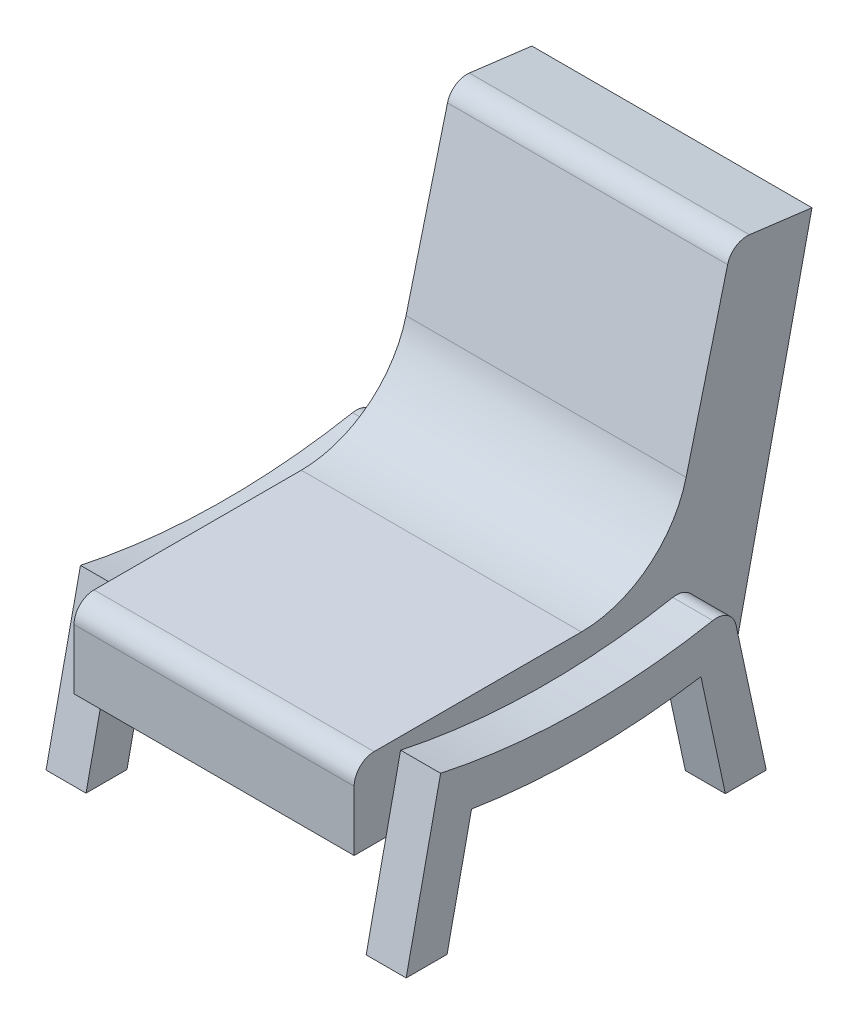
ISO-10303-21;
HEADER;
FILE_DESCRIPTION(('STEP AP214'),'2;1');
FILE_NAME('part.step','',(''),(''),'','','');
FILE_SCHEMA(('AUTOMOTIVE_DESIGN { 1 0 10303 214 1 1 1 1 }'));
ENDSEC;
DATA;
#1=APPLICATION_CONTEXT('core data for automotive mechanical design processes');
#2=APPLICATION_PROTOCOL_DEFINITION('international standard','automotive_design',2000,#1);
#3=PRODUCT_CONTEXT('',#1,'mechanical');
#4=PRODUCT('Part','Part','',(#3));
#5=PRODUCT_RELATED_PRODUCT_CATEGORY('part','',(#4));
#6=PRODUCT_DEFINITION_FORMATION('','',#4);
#7=PRODUCT_DEFINITION_CONTEXT('part definition',#1,'design');
#8=PRODUCT_DEFINITION('design','',#6,#7);
#9=PRODUCT_DEFINITION_SHAPE('','',#8);
#10=(LENGTH_UNIT() NAMED_UNIT(*) SI_UNIT(.MILLI.,.METRE.));
#11=(NAMED_UNIT(*) PLANE_ANGLE_UNIT() SI_UNIT($,.RADIAN.));
#12=(NAMED_UNIT(*) SI_UNIT($,.STERADIAN.) SOLID_ANGLE_UNIT());
#13=UNCERTAINTY_MEASURE_WITH_UNIT(LENGTH_MEASURE(1.E-05),#10,'distance_accuracy_value','');
#14=(GEOMETRIC_REPRESENTATION_CONTEXT(3) GLOBAL_UNCERTAINTY_ASSIGNED_CONTEXT((#13)) GLOBAL_UNIT_ASSIGNED_CONTEXT((#10,
#11,#12)) REPRESENTATION_CONTEXT('',''));
#15=CARTESIAN_POINT('',(0.,0.,0.));
#16=DIRECTION('',(0.,0.,1.));
#17=DIRECTION('',(1.,0.,0.));
#18=AXIS2_PLACEMENT_3D('',#15,#16,#17);
#19=CARTESIAN_POINT('',(80.,38.,43.));
#20=DIRECTION('',(-1.,0.,0.));
#21=DIRECTION('',(0.,0.,1.));
#22=AXIS2_PLACEMENT_3D('',#19,#20,#21);
#23=PLANE('',#22);
#24=DIRECTION('',(0.,-0.977623264558822,-0.21036338225402));
#25=VECTOR('',#24,1.);
#26=CARTESIAN_POINT('',(80.,28.3874434131451,-28.6627470018919));
#27=LINE('',#26,#25);
#28=CARTESIAN_POINT('',(80.,28.3874434131451,-28.6627470018919));
#29=VERTEX_POINT('',#28);
#30=CARTESIAN_POINT('',(80.,23.,-29.8220083034351));
#31=VERTEX_POINT('',#30);
#32=EDGE_CURVE('E271',#29,#31,#27,.T.);
#33=ORIENTED_EDGE('',*,*,#32,.F.);
#34=CARTESIAN_POINT('',(80.,209.128824768676,0.));
#35=DIRECTION('',(1.,0.,0.));
#36=DIRECTION('',(0.,0.,-1.));
#37=AXIS2_PLACEMENT_3D('',#34,#35,#36);
#38=CIRCLE('',#37,183.);
#39=CARTESIAN_POINT('',(80.,28.3874434131451,28.662747001892));
#40=VERTEX_POINT('',#39);
#41=EDGE_CURVE('E245',#40,#29,#38,.T.);
#42=ORIENTED_EDGE('',*,*,#41,.F.);
#43=DIRECTION('',(0.,0.977623264558822,-0.21036338225402));
#44=VECTOR('',#43,1.);
#45=CARTESIAN_POINT('',(80.,0.,34.7711108537165));
#46=LINE('',#45,#44);
#47=CARTESIAN_POINT('',(80.,23.,29.8220083034351));
#48=VERTEX_POINT('',#47);
#49=EDGE_CURVE('E247',#48,#40,#46,.T.);
#50=ORIENTED_EDGE('',*,*,#49,.F.);
#51=DIRECTION('',(0.,0.,-1.));
#52=VECTOR('',#51,1.);
#53=CARTESIAN_POINT('',(80.,23.,48.));
#54=LINE('',#53,#52);
#55=EDGE_CURVE('E502',#48,#31,#54,.T.);
#56=ORIENTED_EDGE('',*,*,#55,.T.);
#57=EDGE_LOOP('',(#33,#42,#50,#56));
#58=FACE_BOUND('',#57,.T.);
#59=ADVANCED_FACE('F33',(#58),#23,.F.);
#60=CARTESIAN_POINT('',(10.,209.128824768676,0.));
#61=DIRECTION('',(1.,0.,0.));
#62=DIRECTION('',(0.,0.,-1.));
#63=AXIS2_PLACEMENT_3D('',#60,#61,#62);
#64=PLANE('',#63);
#65=DIRECTION('',(0.,0.,-1.));
#66=VECTOR('',#65,1.);
#67=CARTESIAN_POINT('',(9.99999999999999,23.,48.));
#68=LINE('',#67,#66);
#69=CARTESIAN_POINT('',(10.,23.,40.0508974497186));
#70=VERTEX_POINT('',#69);
#71=CARTESIAN_POINT('',(10.,23.,29.8220083034351));
#72=VERTEX_POINT('',#71);
#73=EDGE_CURVE('E477',#70,#72,#68,.T.);
#74=ORIENTED_EDGE('',*,*,#73,.F.);
#75=DIRECTION('',(0.,-0.977623264558822,0.21036338225402));
#76=VECTOR('',#75,1.);
#77=CARTESIAN_POINT('',(10.,0.,45.));
#78=LINE('',#77,#76);
#79=CARTESIAN_POINT('',(10.,0.,45.));
#80=VERTEX_POINT('',#79);
#81=EDGE_CURVE('E419',#70,#80,#78,.T.);
#82=ORIENTED_EDGE('',*,*,#81,.T.);
#83=DIRECTION('',(0.,0.,-1.));
#84=VECTOR('',#83,1.);
#85=CARTESIAN_POINT('',(10.,0.,45.));
#86=LINE('',#85,#84);
#87=CARTESIAN_POINT('',(10.,0.,34.7711108537165));
#88=VERTEX_POINT('',#87);
#89=EDGE_CURVE('E396',#80,#88,#86,.T.);
#90=ORIENTED_EDGE('',*,*,#89,.T.);
#91=DIRECTION('',(0.,0.977623264558822,-0.21036338225402));
#92=VECTOR('',#91,1.);
#93=CARTESIAN_POINT('',(10.,0.,34.7711108537165));
#94=LINE('',#93,#92);
#95=EDGE_CURVE('E401',#88,#72,#94,.T.);
#96=ORIENTED_EDGE('',*,*,#95,.T.);
#97=EDGE_LOOP('',(#74,#82,#90,#96));
#98=FACE_BOUND('',#97,.T.);
#99=ADVANCED_FACE('F552',(#98),#64,.T.);
#100=CARTESIAN_POINT('',(10.,0.,45.));
#101=DIRECTION('',(0.,1.,0.));
#102=DIRECTION('',(0.,0.,1.));
#103=AXIS2_PLACEMENT_3D('',#100,#101,#102);
#104=PLANE('',#103);
#105=DIRECTION('',(0.,0.,-1.));
#106=VECTOR('',#105,1.);
#107=CARTESIAN_POINT('',(0.,0.,45.));
#108=LINE('',#107,#106);
#109=CARTESIAN_POINT('',(0.,0.,45.));
#110=VERTEX_POINT('',#109);
#111=CARTESIAN_POINT('',(0.,0.,34.7711108537165));
#112=VERTEX_POINT('',#111);
#113=EDGE_CURVE('E382',#110,#112,#108,.T.);
#114=ORIENTED_EDGE('',*,*,#113,.T.);
#115=DIRECTION('',(-1.,0.,0.));
#116=VECTOR('',#115,1.);
#117=CARTESIAN_POINT('',(10.,0.,34.7711108537165));
#118=LINE('',#117,#116);
#119=EDGE_CURVE('E457',#88,#112,#118,.T.);
#120=ORIENTED_EDGE('',*,*,#119,.F.);
#121=ORIENTED_EDGE('',*,*,#89,.F.);
#122=DIRECTION('',(-1.,0.,0.));
#123=VECTOR('',#122,1.);
#124=CARTESIAN_POINT('',(10.,0.,45.));
#125=LINE('',#124,#123);
#126=EDGE_CURVE('E423',#80,#110,#125,.T.);
#127=ORIENTED_EDGE('',*,*,#126,.T.);
#128=EDGE_LOOP('',(#114,#120,#121,#127));
#129=FACE_BOUND('',#128,.T.);
#130=ADVANCED_FACE('F559',(#129),#104,.F.);
#131=CARTESIAN_POINT('',(10.,0.,34.7711108537165));
#132=DIRECTION('',(0.,0.21036338225402,0.977623264558822));
#133=DIRECTION('',(0.,-0.977623264558823,0.21036338225402));
#134=AXIS2_PLACEMENT_3D('',#131,#132,#133);
#135=PLANE('',#134);
#136=DIRECTION('',(0.,0.977623264558822,-0.21036338225402));
#137=VECTOR('',#136,1.);
#138=CARTESIAN_POINT('',(0.,0.,34.7711108537165));
#139=LINE('',#138,#137);
#140=CARTESIAN_POINT('',(0.,28.3874434131451,28.662747001892));
#141=VERTEX_POINT('',#140);
#142=EDGE_CURVE('E426',#112,#141,#139,.T.);
#143=ORIENTED_EDGE('',*,*,#142,.T.);
#144=DIRECTION('',(-1.,0.,0.));
#145=VECTOR('',#144,1.);
#146=CARTESIAN_POINT('',(10.,28.3874434131451,28.662747001892));
#147=LINE('',#146,#145);
#148=CARTESIAN_POINT('',(10.,28.3874434131451,28.662747001892));
#149=VERTEX_POINT('',#148);
#150=EDGE_CURVE('E454',#149,#141,#147,.T.);
#151=ORIENTED_EDGE('',*,*,#150,.F.);
#152=EDGE_CURVE('E399',#72,#149,#94,.T.);
#153=ORIENTED_EDGE('',*,*,#152,.F.);
#154=ORIENTED_EDGE('',*,*,#95,.F.);
#155=ORIENTED_EDGE('',*,*,#119,.T.);
#156=EDGE_LOOP('',(#143,#151,#153,#154,#155));
#157=FACE_BOUND('',#156,.T.);
#158=ADVANCED_FACE('F607',(#157),#135,.F.);
#159=CARTESIAN_POINT('',(10.,209.128824768676,0.));
#160=DIRECTION('',(-1.,0.,0.));
#161=DIRECTION('',(0.,0.,1.));
#162=AXIS2_PLACEMENT_3D('',#159,#160,#161);
#163=CYLINDRICAL_SURFACE('',#162,183.);
#164=CARTESIAN_POINT('',(0.,209.128824768676,0.));
#165=DIRECTION('',(1.,0.,0.));
#166=DIRECTION('',(0.,0.,-1.));
#167=AXIS2_PLACEMENT_3D('',#164,#165,#166);
#168=CIRCLE('',#167,183.);
#169=CARTESIAN_POINT('',(0.,28.3874434131451,-28.6627470018919));
#170=VERTEX_POINT('',#169);
#171=EDGE_CURVE('E428',#141,#170,#168,.T.);
#172=ORIENTED_EDGE('',*,*,#171,.T.);
#173=DIRECTION('',(-1.,0.,0.));
#174=VECTOR('',#173,1.);
#175=CARTESIAN_POINT('',(10.,28.3874434131451,-28.6627470018919));
#176=LINE('',#175,#174);
#177=CARTESIAN_POINT('',(10.,28.3874434131451,-28.6627470018919));
#178=VERTEX_POINT('',#177);
#179=EDGE_CURVE('E451',#178,#170,#176,.T.);
#180=ORIENTED_EDGE('',*,*,#179,.F.);
#181=CARTESIAN_POINT('',(10.,209.128824768676,0.));
#182=DIRECTION('',(1.,0.,0.));
#183=DIRECTION('',(0.,0.,-1.));
#184=AXIS2_PLACEMENT_3D('',#181,#182,#183);
#185=CIRCLE('',#184,183.);
#186=EDGE_CURVE('E404',#149,#178,#185,.T.);
#187=ORIENTED_EDGE('',*,*,#186,.F.);
#188=ORIENTED_EDGE('',*,*,#150,.T.);
#189=EDGE_LOOP('',(#172,#180,#187,#188));
#190=FACE_BOUND('',#189,.T.);
#191=ADVANCED_FACE('F603',(#190),#163,.T.);
#192=CARTESIAN_POINT('',(10.,28.3874434131451,-28.6627470018919));
#193=DIRECTION('',(0.,0.21036338225402,-0.977623264558822));
#194=DIRECTION('',(0.,0.977623264558822,0.21036338225402));
#195=AXIS2_PLACEMENT_3D('',#192,#193,#194);
#196=PLANE('',#195);
#197=DIRECTION('',(0.,-0.977623264558822,-0.21036338225402));
#198=VECTOR('',#197,1.);
#199=CARTESIAN_POINT('',(0.,28.3874434131451,-28.6627470018919));
#200=LINE('',#199,#198);
#201=CARTESIAN_POINT('',(0.,0.,-34.7711108537165));
#202=VERTEX_POINT('',#201);
#203=EDGE_CURVE('E430',#170,#202,#200,.T.);
#204=ORIENTED_EDGE('',*,*,#203,.T.);
#205=DIRECTION('',(-1.,0.,0.));
#206=VECTOR('',#205,1.);
#207=CARTESIAN_POINT('',(10.,0.,-34.7711108537165));
#208=LINE('',#207,#206);
#209=CARTESIAN_POINT('',(10.,0.,-34.7711108537165));
#210=VERTEX_POINT('',#209);
#211=EDGE_CURVE('E448',#210,#202,#208,.T.);
#212=ORIENTED_EDGE('',*,*,#211,.F.);
#213=DIRECTION('',(0.,-0.977623264558822,-0.21036338225402));
#214=VECTOR('',#213,1.);
#215=CARTESIAN_POINT('',(10.,28.3874434131451,-28.6627470018919));
#216=LINE('',#215,#214);
#217=CARTESIAN_POINT('',(10.,23.,-29.8220083034351));
#218=VERTEX_POINT('',#217);
#219=EDGE_CURVE('E407',#218,#210,#216,.T.);
#220=ORIENTED_EDGE('',*,*,#219,.F.);
#221=EDGE_CURVE('E408',#178,#218,#216,.T.);
#222=ORIENTED_EDGE('',*,*,#221,.F.);
#223=ORIENTED_EDGE('',*,*,#179,.T.);
#224=EDGE_LOOP('',(#204,#212,#220,#222,#223));
#225=FACE_BOUND('',#224,.T.);
#226=ADVANCED_FACE('F599',(#225),#196,.F.);
#227=CARTESIAN_POINT('',(10.,0.,-45.));
#228=DIRECTION('',(0.,1.,0.));
#229=DIRECTION('',(0.,0.,1.));
#230=AXIS2_PLACEMENT_3D('',#227,#228,#229);
#231=PLANE('',#230);
#232=DIRECTION('',(0.,0.,-1.));
#233=VECTOR('',#232,1.);
#234=CARTESIAN_POINT('',(0.,0.,-45.));
#235=LINE('',#234,#233);
#236=CARTESIAN_POINT('',(0.,0.,-45.));
#237=VERTEX_POINT('',#236);
#238=EDGE_CURVE('E432',#202,#237,#235,.T.);
#239=ORIENTED_EDGE('',*,*,#238,.T.);
#240=DIRECTION('',(-1.,0.,0.));
#241=VECTOR('',#240,1.);
#242=CARTESIAN_POINT('',(10.,0.,-45.));
#243=LINE('',#242,#241);
#244=CARTESIAN_POINT('',(10.,0.,-45.));
#245=VERTEX_POINT('',#244);
#246=EDGE_CURVE('E445',#245,#237,#243,.T.);
#247=ORIENTED_EDGE('',*,*,#246,.F.);
#248=DIRECTION('',(0.,0.,-1.));
#249=VECTOR('',#248,1.);
#250=CARTESIAN_POINT('',(10.,0.,-45.));
#251=LINE('',#250,#249);
#252=EDGE_CURVE('E411',#210,#245,#251,.T.);
#253=ORIENTED_EDGE('',*,*,#252,.F.);
#254=ORIENTED_EDGE('',*,*,#211,.T.);
#255=EDGE_LOOP('',(#239,#247,#253,#254));
#256=FACE_BOUND('',#255,.T.);
#257=ADVANCED_FACE('F595',(#256),#231,.F.);
#258=CARTESIAN_POINT('',(10.,40.,-36.3928651299454));
#259=DIRECTION('',(0.,-0.21036338225402,0.977623264558822));
#260=DIRECTION('',(0.,-0.977623264558822,-0.21036338225402));
#261=AXIS2_PLACEMENT_3D('',#258,#259,#260);
#262=PLANE('',#261);
#263=DIRECTION('',(0.,0.977623264558822,0.21036338225402));
#264=VECTOR('',#263,1.);
#265=CARTESIAN_POINT('',(0.,40.,-36.3928651299454));
#266=LINE('',#265,#264);
#267=CARTESIAN_POINT('',(0.,35.1805505442761,-37.4299064165661));
#268=VERTEX_POINT('',#267);
#269=EDGE_CURVE('E434',#237,#268,#266,.T.);
#270=ORIENTED_EDGE('',*,*,#269,.T.);
#271=DIRECTION('',(-1.,0.,0.));
#272=VECTOR('',#271,1.);
#273=CARTESIAN_POINT('',(10.,35.1805505442761,-37.4299064165661));
#274=LINE('',#273,#272);
#275=CARTESIAN_POINT('',(10.,35.1805505442761,-37.4299064165661));
#276=VERTEX_POINT('',#275);
#277=EDGE_CURVE('E465',#268,#276,#274,.F.);
#278=ORIENTED_EDGE('',*,*,#277,.T.);
#279=DIRECTION('',(0.,0.977623264558822,0.21036338225402));
#280=VECTOR('',#279,1.);
#281=CARTESIAN_POINT('',(10.,40.,-36.3928651299454));
#282=LINE('',#281,#280);
#283=CARTESIAN_POINT('',(9.99999999999999,23.,-40.0508974497186));
#284=VERTEX_POINT('',#283);
#285=EDGE_CURVE('E413',#284,#276,#282,.T.);
#286=ORIENTED_EDGE('',*,*,#285,.F.);
#287=EDGE_CURVE('E414',#245,#284,#282,.T.);
#288=ORIENTED_EDGE('',*,*,#287,.F.);
#289=ORIENTED_EDGE('',*,*,#246,.T.);
#290=EDGE_LOOP('',(#270,#278,#286,#288,#289));
#291=FACE_BOUND('',#290,.T.);
#292=ADVANCED_FACE('F591',(#291),#262,.F.);
#293=CARTESIAN_POINT('',(10.,209.128824768676,0.));
#294=DIRECTION('',(-1.,0.,0.));
#295=DIRECTION('',(0.,0.,1.));
#296=AXIS2_PLACEMENT_3D('',#293,#294,#295);
#297=CYLINDRICAL_SURFACE('',#296,173.);
#298=CARTESIAN_POINT('',(10.,209.128824768676,0.));
#299=DIRECTION('',(-1.,0.,0.));
#300=DIRECTION('',(0.,0.,-1.));
#301=AXIS2_PLACEMENT_3D('',#298,#299,#300);
#302=CIRCLE('',#301,173.);
#303=CARTESIAN_POINT('',(10.,39.0444665300754,-31.6276948664188));
#304=VERTEX_POINT('',#303);
#305=CARTESIAN_POINT('',(10.,40.,36.3928651299455));
#306=VERTEX_POINT('',#305);
#307=EDGE_CURVE('E416',#304,#306,#302,.T.);
#308=ORIENTED_EDGE('',*,*,#307,.F.);
#309=DIRECTION('',(-1.,0.,0.));
#310=VECTOR('',#309,1.);
#311=CARTESIAN_POINT('',(10.,39.0444665300754,-31.6276948664189));
#312=LINE('',#311,#310);
#313=CARTESIAN_POINT('',(0.,39.0444665300754,-31.6276948664188));
#314=VERTEX_POINT('',#313);
#315=EDGE_CURVE('E460',#304,#314,#312,.T.);
#316=ORIENTED_EDGE('',*,*,#315,.T.);
#317=CARTESIAN_POINT('',(0.,209.128824768676,0.));
#318=DIRECTION('',(-1.,0.,0.));
#319=DIRECTION('',(0.,0.,-1.));
#320=AXIS2_PLACEMENT_3D('',#317,#318,#319);
#321=CIRCLE('',#320,173.);
#322=CARTESIAN_POINT('',(0.,40.,36.3928651299455));
#323=VERTEX_POINT('',#322);
#324=EDGE_CURVE('E437',#314,#323,#321,.T.);
#325=ORIENTED_EDGE('',*,*,#324,.T.);
#326=DIRECTION('',(-1.,0.,0.));
#327=VECTOR('',#326,1.);
#328=CARTESIAN_POINT('',(10.,40.,36.3928651299455));
#329=LINE('',#328,#327);
#330=EDGE_CURVE('E442',#306,#323,#329,.T.);
#331=ORIENTED_EDGE('',*,*,#330,.F.);
#332=EDGE_LOOP('',(#308,#316,#325,#331));
#333=FACE_BOUND('',#332,.T.);
#334=ADVANCED_FACE('F587',(#333),#297,.F.);
#335=CARTESIAN_POINT('',(10.,0.,45.));
#336=DIRECTION('',(0.,-0.21036338225402,-0.977623264558822));
#337=DIRECTION('',(0.,0.977623264558822,-0.21036338225402));
#338=AXIS2_PLACEMENT_3D('',#335,#336,#337);
#339=PLANE('',#338);
#340=DIRECTION('',(0.,-0.977623264558822,0.21036338225402));
#341=VECTOR('',#340,1.);
#342=CARTESIAN_POINT('',(0.,0.,45.));
#343=LINE('',#342,#341);
#344=EDGE_CURVE('E400',#323,#110,#343,.T.);
#345=ORIENTED_EDGE('',*,*,#344,.T.);
#346=ORIENTED_EDGE('',*,*,#126,.F.);
#347=ORIENTED_EDGE('',*,*,#81,.F.);
#348=EDGE_CURVE('E420',#306,#70,#78,.T.);
#349=ORIENTED_EDGE('',*,*,#348,.F.);
#350=ORIENTED_EDGE('',*,*,#330,.T.);
#351=EDGE_LOOP('',(#345,#346,#347,#349,#350));
#352=FACE_BOUND('',#351,.T.);
#353=ADVANCED_FACE('F579',(#352),#339,.F.);
#354=EDGE_CURVE('E368',#218,#284,#68,.T.);
#355=ORIENTED_EDGE('',*,*,#354,.F.);
#356=ORIENTED_EDGE('',*,*,#219,.T.);
#357=ORIENTED_EDGE('',*,*,#252,.T.);
#358=ORIENTED_EDGE('',*,*,#287,.T.);
#359=EDGE_LOOP('',(#355,#356,#357,#358));
#360=FACE_BOUND('',#359,.T.);
#361=ADVANCED_FACE('F562',(#360),#64,.T.);
#362=CARTESIAN_POINT('',(0.,209.128824768676,0.));
#363=DIRECTION('',(1.,0.,0.));
#364=DIRECTION('',(0.,0.,-1.));
#365=AXIS2_PLACEMENT_3D('',#362,#363,#364);
#366=PLANE('',#365);
#367=ORIENTED_EDGE('',*,*,#324,.F.);
#368=CARTESIAN_POINT('',(0.,34.128733633006,-32.541790093772));
#369=DIRECTION('',(1.,0.,0.));
#370=DIRECTION('',(0.,0.,-1.));
#371=AXIS2_PLACEMENT_3D('',#368,#369,#370);
#372=CIRCLE('',#371,5.);
#373=EDGE_CURVE('E463',#314,#268,#372,.F.);
#374=ORIENTED_EDGE('',*,*,#373,.T.);
#375=ORIENTED_EDGE('',*,*,#269,.F.);
#376=ORIENTED_EDGE('',*,*,#238,.F.);
#377=ORIENTED_EDGE('',*,*,#203,.F.);
#378=ORIENTED_EDGE('',*,*,#171,.F.);
#379=ORIENTED_EDGE('',*,*,#142,.F.);
#380=ORIENTED_EDGE('',*,*,#113,.F.);
#381=ORIENTED_EDGE('',*,*,#344,.F.);
#382=EDGE_LOOP('',(#367,#374,#375,#376,#377,#378,#379,#380,#381));
#383=FACE_BOUND('',#382,.T.);
#384=ADVANCED_FACE('F578',(#383),#366,.F.);
#385=CARTESIAN_POINT('',(10.,34.128733633006,-32.541790093772));
#386=DIRECTION('',(-1.,0.,0.));
#387=DIRECTION('',(0.,0.,1.));
#388=AXIS2_PLACEMENT_3D('',#385,#386,#387);
#389=CYLINDRICAL_SURFACE('',#388,5.);
#390=CARTESIAN_POINT('',(10.,34.128733633006,-32.541790093772));
#391=DIRECTION('',(1.,0.,0.));
#392=DIRECTION('',(0.,0.,-1.));
#393=AXIS2_PLACEMENT_3D('',#390,#391,#392);
#394=CIRCLE('',#393,5.);
#395=EDGE_CURVE('E467',#276,#304,#394,.T.);
#396=ORIENTED_EDGE('',*,*,#395,.F.);
#397=ORIENTED_EDGE('',*,*,#277,.F.);
#398=ORIENTED_EDGE('',*,*,#373,.F.);
#399=ORIENTED_EDGE('',*,*,#315,.F.);
#400=EDGE_LOOP('',(#396,#397,#398,#399));
#401=FACE_BOUND('',#400,.T.);
#402=ADVANCED_FACE('F583',(#401),#389,.T.);
#403=CARTESIAN_POINT('',(9.99999999999999,38.,43.));
#404=DIRECTION('',(-1.,0.,0.));
#405=DIRECTION('',(0.,0.,1.));
#406=AXIS2_PLACEMENT_3D('',#403,#404,#405);
#407=PLANE('',#406);
#408=DIRECTION('',(0.,0.969310344580997,-0.245840305662576));
#409=VECTOR('',#408,1.);
#410=CARTESIAN_POINT('',(9.99999999999999,106.741704173388,-45.9670958601257));
#411=LINE('',#410,#409);
#412=CARTESIAN_POINT('',(9.99999999999999,63.3623117471105,-34.9650435729991));
#413=VERTEX_POINT('',#412);
#414=CARTESIAN_POINT('',(9.99999999999999,104.232276988287,-45.3306450580971));
#415=VERTEX_POINT('',#414);
#416=EDGE_CURVE('E329',#413,#415,#411,.T.);
#417=ORIENTED_EDGE('',*,*,#416,.T.);
#418=CARTESIAN_POINT('',(9.99999999999999,103.003075459974,-50.1771967810021));
#419=DIRECTION('',(-1.,0.,0.));
#420=DIRECTION('',(0.,0.,1.));
#421=AXIS2_PLACEMENT_3D('',#418,#419,#420);
#422=CIRCLE('',#421,5.);
#423=CARTESIAN_POINT('',(9.99999999999999,107.96399357497,-50.8011290339819));
#424=VERTEX_POINT('',#423);
#425=EDGE_CURVE('E55',#415,#424,#422,.T.);
#426=ORIENTED_EDGE('',*,*,#425,.T.);
#427=DIRECTION('',(0.,-0.124786450595951,-0.992183622999122));
#428=VECTOR('',#427,1.);
#429=CARTESIAN_POINT('',(9.99999999999999,108.515390250421,-46.4169451057929));
#430=LINE('',#429,#428);
#431=CARTESIAN_POINT('',(9.99999999999999,106.,-66.4169451057929));
#432=VERTEX_POINT('',#431);
#433=EDGE_CURVE('E357',#424,#432,#430,.T.);
#434=ORIENTED_EDGE('',*,*,#433,.T.);
#435=DIRECTION('',(0.,-0.976255506895255,0.216622217827927));
#436=VECTOR('',#435,1.);
#437=CARTESIAN_POINT('',(9.99999999999999,106.,-66.4169451057929));
#438=LINE('',#437,#436);
#439=CARTESIAN_POINT('',(9.99999999999999,23.,-48.));
#440=VERTEX_POINT('',#439);
#441=EDGE_CURVE('E359',#432,#440,#438,.T.);
#442=ORIENTED_EDGE('',*,*,#441,.T.);
#443=EDGE_CURVE('E362',#284,#440,#68,.T.);
#444=ORIENTED_EDGE('',*,*,#443,.F.);
#445=ORIENTED_EDGE('',*,*,#285,.T.);
#446=ORIENTED_EDGE('',*,*,#395,.T.);
#447=ORIENTED_EDGE('',*,*,#307,.T.);
#448=ORIENTED_EDGE('',*,*,#348,.T.);
#449=CARTESIAN_POINT('',(9.99999999999999,23.,48.));
#450=VERTEX_POINT('',#449);
#451=EDGE_CURVE('E363',#450,#70,#68,.T.);
#452=ORIENTED_EDGE('',*,*,#451,.F.);
#453=DIRECTION('',(0.,1.,0.));
#454=VECTOR('',#453,1.);
#455=CARTESIAN_POINT('',(9.99999999999999,23.,48.));
#456=LINE('',#455,#454);
#457=CARTESIAN_POINT('',(9.99999999999999,38.,48.));
#458=VERTEX_POINT('',#457);
#459=EDGE_CURVE('E366',#450,#458,#456,.T.);
#460=ORIENTED_EDGE('',*,*,#459,.T.);
#461=CARTESIAN_POINT('',(9.99999999999999,38.,43.));
#462=DIRECTION('',(-1.,0.,0.));
#463=DIRECTION('',(0.,0.,1.));
#464=AXIS2_PLACEMENT_3D('',#461,#462,#463);
#465=CIRCLE('',#464,5.);
#466=CARTESIAN_POINT('',(9.99999999999999,43.,43.));
#467=VERTEX_POINT('',#466);
#468=EDGE_CURVE('E371',#458,#467,#465,.T.);
#469=ORIENTED_EDGE('',*,*,#468,.T.);
#470=DIRECTION('',(0.,0.,-1.));
#471=VECTOR('',#470,1.);
#472=CARTESIAN_POINT('',(9.99999999999999,43.,43.));
#473=LINE('',#472,#471);
#474=CARTESIAN_POINT('',(9.99999999999999,43.,-8.79366426931216));
#475=VERTEX_POINT('',#474);
#476=EDGE_CURVE('E374',#467,#475,#473,.T.);
#477=ORIENTED_EDGE('',*,*,#476,.T.);
#478=CARTESIAN_POINT('',(9.99999999999999,70.,-8.79366426931216));
#479=DIRECTION('',(1.,0.,0.));
#480=DIRECTION('',(0.,0.,-1.));
#481=AXIS2_PLACEMENT_3D('',#478,#479,#480);
#482=CIRCLE('',#481,27.);
#483=EDGE_CURVE('E334',#475,#413,#482,.T.);
#484=ORIENTED_EDGE('',*,*,#483,.T.);
#485=EDGE_LOOP('',(#417,#426,#434,#442,#444,#445,#446,#447,#448,#452,#460,#469,#477,#484));
#486=FACE_BOUND('',#485,.T.);
#487=ADVANCED_FACE('F495',(#486),#407,.T.);
#488=CARTESIAN_POINT('',(80.,70.,-8.79366426931216));
#489=DIRECTION('',(-1.,0.,0.));
#490=DIRECTION('',(0.,0.,1.));
#491=AXIS2_PLACEMENT_3D('',#488,#489,#490);
#492=CYLINDRICAL_SURFACE('',#491,27.);
#493=ORIENTED_EDGE('',*,*,#483,.F.);
#494=DIRECTION('',(-1.,0.,0.));
#495=VECTOR('',#494,1.);
#496=CARTESIAN_POINT('',(80.,43.,-8.79366426931216));
#497=LINE('',#496,#495);
#498=CARTESIAN_POINT('',(80.,43.,-8.79366426931216));
#499=VERTEX_POINT('',#498);
#500=EDGE_CURVE('E383',#499,#475,#497,.T.);
#501=ORIENTED_EDGE('',*,*,#500,.F.);
#502=CARTESIAN_POINT('',(80.,70.,-8.79366426931216));
#503=DIRECTION('',(1.,0.,0.));
#504=DIRECTION('',(0.,0.,-1.));
#505=AXIS2_PLACEMENT_3D('',#502,#503,#504);
#506=CIRCLE('',#505,27.);
#507=CARTESIAN_POINT('',(80.,63.3623117471105,-34.9650435729991));
#508=VERTEX_POINT('',#507);
#509=EDGE_CURVE('E352',#499,#508,#506,.T.);
#510=ORIENTED_EDGE('',*,*,#509,.T.);
#511=DIRECTION('',(-1.,0.,0.));
#512=VECTOR('',#511,1.);
#513=CARTESIAN_POINT('',(80.,63.3623117471105,-34.9650435729991));
#514=LINE('',#513,#512);
#515=EDGE_CURVE('E379',#508,#413,#514,.T.);
#516=ORIENTED_EDGE('',*,*,#515,.T.);
#517=EDGE_LOOP('',(#493,#501,#510,#516));
#518=FACE_BOUND('',#517,.T.);
#519=ADVANCED_FACE('F537',(#518),#492,.F.);
#520=CARTESIAN_POINT('',(80.,43.,43.));
#521=DIRECTION('',(0.,1.,0.));
#522=DIRECTION('',(0.,0.,1.));
#523=AXIS2_PLACEMENT_3D('',#520,#521,#522);
#524=PLANE('',#523);
#525=ORIENTED_EDGE('',*,*,#476,.F.);
#526=DIRECTION('',(-1.,0.,0.));
#527=VECTOR('',#526,1.);
#528=CARTESIAN_POINT('',(80.,43.,43.));
#529=LINE('',#528,#527);
#530=CARTESIAN_POINT('',(80.,43.,43.));
#531=VERTEX_POINT('',#530);
#532=EDGE_CURVE('E385',#531,#467,#529,.T.);
#533=ORIENTED_EDGE('',*,*,#532,.F.);
#534=DIRECTION('',(0.,0.,-1.));
#535=VECTOR('',#534,1.);
#536=CARTESIAN_POINT('',(80.,43.,43.));
#537=LINE('',#536,#535);
#538=EDGE_CURVE('E349',#531,#499,#537,.T.);
#539=ORIENTED_EDGE('',*,*,#538,.T.);
#540=ORIENTED_EDGE('',*,*,#500,.T.);
#541=EDGE_LOOP('',(#525,#533,#539,#540));
#542=FACE_BOUND('',#541,.T.);
#543=ADVANCED_FACE('F645',(#542),#524,.T.);
#544=CARTESIAN_POINT('',(80.,38.,43.));
#545=DIRECTION('',(-1.,0.,0.));
#546=DIRECTION('',(0.,0.,1.));
#547=AXIS2_PLACEMENT_3D('',#544,#545,#546);
#548=CYLINDRICAL_SURFACE('',#547,5.);
#549=ORIENTED_EDGE('',*,*,#468,.F.);
#550=DIRECTION('',(-1.,0.,0.));
#551=VECTOR('',#550,1.);
#552=CARTESIAN_POINT('',(80.,38.,48.));
#553=LINE('',#552,#551);
#554=CARTESIAN_POINT('',(80.,38.,48.));
#555=VERTEX_POINT('',#554);
#556=EDGE_CURVE('E387',#555,#458,#553,.T.);
#557=ORIENTED_EDGE('',*,*,#556,.F.);
#558=CARTESIAN_POINT('',(80.,38.,43.));
#559=DIRECTION('',(-1.,0.,0.));
#560=DIRECTION('',(0.,0.,1.));
#561=AXIS2_PLACEMENT_3D('',#558,#559,#560);
#562=CIRCLE('',#561,5.);
#563=EDGE_CURVE('E346',#555,#531,#562,.T.);
#564=ORIENTED_EDGE('',*,*,#563,.T.);
#565=ORIENTED_EDGE('',*,*,#532,.T.);
#566=EDGE_LOOP('',(#549,#557,#564,#565));
#567=FACE_BOUND('',#566,.T.);
#568=ADVANCED_FACE('F532',(#567),#548,.T.);
#569=CARTESIAN_POINT('',(80.,23.,48.));
#570=DIRECTION('',(0.,0.,1.));
#571=DIRECTION('',(1.,0.,0.));
#572=AXIS2_PLACEMENT_3D('',#569,#570,#571);
#573=PLANE('',#572);
#574=ORIENTED_EDGE('',*,*,#459,.F.);
#575=DIRECTION('',(-1.,0.,0.));
#576=VECTOR('',#575,1.);
#577=CARTESIAN_POINT('',(80.,23.,48.));
#578=LINE('',#577,#576);
#579=CARTESIAN_POINT('',(80.,23.,48.));
#580=VERTEX_POINT('',#579);
#581=EDGE_CURVE('E389',#580,#450,#578,.T.);
#582=ORIENTED_EDGE('',*,*,#581,.F.);
#583=DIRECTION('',(0.,1.,0.));
#584=VECTOR('',#583,1.);
#585=CARTESIAN_POINT('',(80.,23.,48.));
#586=LINE('',#585,#584);
#587=EDGE_CURVE('E343',#580,#555,#586,.T.);
#588=ORIENTED_EDGE('',*,*,#587,.T.);
#589=ORIENTED_EDGE('',*,*,#556,.T.);
#590=EDGE_LOOP('',(#574,#582,#588,#589));
#591=FACE_BOUND('',#590,.T.);
#592=ADVANCED_FACE('F529',(#591),#573,.T.);
#593=CARTESIAN_POINT('',(80.,23.,48.));
#594=DIRECTION('',(0.,1.,0.));
#595=DIRECTION('',(0.,0.,1.));
#596=AXIS2_PLACEMENT_3D('',#593,#594,#595);
#597=PLANE('',#596);
#598=ORIENTED_EDGE('',*,*,#451,.T.);
#599=ORIENTED_EDGE('',*,*,#73,.T.);
#600=EDGE_CURVE('E367',#72,#218,#68,.T.);
#601=ORIENTED_EDGE('',*,*,#600,.T.);
#602=ORIENTED_EDGE('',*,*,#354,.T.);
#603=ORIENTED_EDGE('',*,*,#443,.T.);
#604=DIRECTION('',(-1.,0.,0.));
#605=VECTOR('',#604,1.);
#606=CARTESIAN_POINT('',(80.,23.,-48.));
#607=LINE('',#606,#605);
#608=CARTESIAN_POINT('',(80.,23.,-48.));
#609=VERTEX_POINT('',#608);
#610=EDGE_CURVE('E391',#609,#440,#607,.T.);
#611=ORIENTED_EDGE('',*,*,#610,.F.);
#612=CARTESIAN_POINT('',(80.,23.,-40.0508974497186));
#613=VERTEX_POINT('',#612);
#614=EDGE_CURVE('E339',#613,#609,#54,.T.);
#615=ORIENTED_EDGE('',*,*,#614,.F.);
#616=EDGE_CURVE('E501',#31,#613,#54,.T.);
#617=ORIENTED_EDGE('',*,*,#616,.F.);
#618=ORIENTED_EDGE('',*,*,#55,.F.);
#619=CARTESIAN_POINT('',(80.,23.,40.0508974497186));
#620=VERTEX_POINT('',#619);
#621=EDGE_CURVE('E242',#620,#48,#54,.T.);
#622=ORIENTED_EDGE('',*,*,#621,.F.);
#623=EDGE_CURVE('E340',#580,#620,#54,.T.);
#624=ORIENTED_EDGE('',*,*,#623,.F.);
#625=ORIENTED_EDGE('',*,*,#581,.T.);
#626=EDGE_LOOP('',(#598,#599,#601,#602,#603,#611,#615,#617,#618,#622,#624,#625));
#627=FACE_BOUND('',#626,.T.);
#628=ADVANCED_FACE('F487',(#627),#597,.F.);
#629=CARTESIAN_POINT('',(80.,106.,-66.4169451057929));
#630=DIRECTION('',(0.,-0.216622217827927,-0.976255506895255));
#631=DIRECTION('',(0.,0.976255506895255,-0.216622217827927));
#632=AXIS2_PLACEMENT_3D('',#629,#630,#631);
#633=PLANE('',#632);
#634=ORIENTED_EDGE('',*,*,#441,.F.);
#635=DIRECTION('',(-1.,0.,0.));
#636=VECTOR('',#635,1.);
#637=CARTESIAN_POINT('',(80.,106.,-66.4169451057929));
#638=LINE('',#637,#636);
#639=CARTESIAN_POINT('',(80.,106.,-66.4169451057929));
#640=VERTEX_POINT('',#639);
#641=EDGE_CURVE('E355',#640,#432,#638,.T.);
#642=ORIENTED_EDGE('',*,*,#641,.F.);
#643=DIRECTION('',(0.,-0.976255506895255,0.216622217827927));
#644=VECTOR('',#643,1.);
#645=CARTESIAN_POINT('',(80.,106.,-66.4169451057929));
#646=LINE('',#645,#644);
#647=EDGE_CURVE('E336',#640,#609,#646,.T.);
#648=ORIENTED_EDGE('',*,*,#647,.T.);
#649=ORIENTED_EDGE('',*,*,#610,.T.);
#650=EDGE_LOOP('',(#634,#642,#648,#649));
#651=FACE_BOUND('',#650,.T.);
#652=ADVANCED_FACE('F492',(#651),#633,.T.);
#653=CARTESIAN_POINT('',(80.,108.515390250421,-46.4169451057929));
#654=DIRECTION('',(0.,0.992183622999122,-0.124786450595951));
#655=DIRECTION('',(0.,0.124786450595951,0.992183622999122));
#656=AXIS2_PLACEMENT_3D('',#653,#654,#655);
#657=PLANE('',#656);
#658=ORIENTED_EDGE('',*,*,#433,.F.);
#659=DIRECTION('',(-1.,0.,0.));
#660=VECTOR('',#659,1.);
#661=CARTESIAN_POINT('',(80.,107.96399357497,-50.8011290339819));
#662=LINE('',#661,#660);
#663=CARTESIAN_POINT('',(80.,107.96399357497,-50.8011290339819));
#664=VERTEX_POINT('',#663);
#665=EDGE_CURVE('E41',#424,#664,#662,.F.);
#666=ORIENTED_EDGE('',*,*,#665,.T.);
#667=DIRECTION('',(0.,-0.124786450595951,-0.992183622999122));
#668=VECTOR('',#667,1.);
#669=CARTESIAN_POINT('',(80.,108.515390250421,-46.4169451057929));
#670=LINE('',#669,#668);
#671=EDGE_CURVE('E333',#664,#640,#670,.T.);
#672=ORIENTED_EDGE('',*,*,#671,.T.);
#673=ORIENTED_EDGE('',*,*,#641,.T.);
#674=EDGE_LOOP('',(#658,#666,#672,#673));
#675=FACE_BOUND('',#674,.T.);
#676=ADVANCED_FACE('F496',(#675),#657,.T.);
#677=CARTESIAN_POINT('',(80.,106.741704173388,-45.9670958601257));
#678=DIRECTION('',(0.,0.245840305662576,0.969310344580997));
#679=DIRECTION('',(0.,-0.969310344580997,0.245840305662576));
#680=AXIS2_PLACEMENT_3D('',#677,#678,#679);
#681=PLANE('',#680);
#682=DIRECTION('',(0.,0.969310344580997,-0.245840305662575));
#683=VECTOR('',#682,1.);
#684=CARTESIAN_POINT('',(80.,63.3623117471105,-34.9650435729991));
#685=LINE('',#684,#683);
#686=CARTESIAN_POINT('',(80.,104.232276988287,-45.3306450580971));
#687=VERTEX_POINT('',#686);
#688=EDGE_CURVE('E330',#508,#687,#685,.T.);
#689=ORIENTED_EDGE('',*,*,#688,.T.);
#690=DIRECTION('',(-1.,0.,0.));
#691=VECTOR('',#690,1.);
#692=CARTESIAN_POINT('',(80.,104.232276988287,-45.3306450580971));
#693=LINE('',#692,#691);
#694=EDGE_CURVE('E470',#687,#415,#693,.T.);
#695=ORIENTED_EDGE('',*,*,#694,.T.);
#696=ORIENTED_EDGE('',*,*,#416,.F.);
#697=ORIENTED_EDGE('',*,*,#515,.F.);
#698=EDGE_LOOP('',(#689,#695,#696,#697));
#699=FACE_BOUND('',#698,.T.);
#700=ADVANCED_FACE('F540',(#699),#681,.T.);
#701=ORIENTED_EDGE('',*,*,#671,.F.);
#702=CARTESIAN_POINT('',(80.,103.003075459974,-50.1771967810021));
#703=DIRECTION('',(-1.,0.,0.));
#704=DIRECTION('',(0.,0.,1.));
#705=AXIS2_PLACEMENT_3D('',#702,#703,#704);
#706=CIRCLE('',#705,5.);
#707=EDGE_CURVE('E11',#664,#687,#706,.F.);
#708=ORIENTED_EDGE('',*,*,#707,.T.);
#709=ORIENTED_EDGE('',*,*,#688,.F.);
#710=ORIENTED_EDGE('',*,*,#509,.F.);
#711=ORIENTED_EDGE('',*,*,#538,.F.);
#712=ORIENTED_EDGE('',*,*,#563,.F.);
#713=ORIENTED_EDGE('',*,*,#587,.F.);
#714=ORIENTED_EDGE('',*,*,#623,.T.);
#715=DIRECTION('',(0.,-0.977623264558822,0.21036338225402));
#716=VECTOR('',#715,1.);
#717=CARTESIAN_POINT('',(80.,0.,45.));
#718=LINE('',#717,#716);
#719=CARTESIAN_POINT('',(80.,40.,36.3928651299455));
#720=VERTEX_POINT('',#719);
#721=EDGE_CURVE('E285',#720,#620,#718,.T.);
#722=ORIENTED_EDGE('',*,*,#721,.F.);
#723=CARTESIAN_POINT('',(80.,209.128824768676,0.));
#724=DIRECTION('',(-1.,0.,0.));
#725=DIRECTION('',(0.,0.,-1.));
#726=AXIS2_PLACEMENT_3D('',#723,#724,#725);
#727=CIRCLE('',#726,173.);
#728=CARTESIAN_POINT('',(80.,39.0444665300754,-31.6276948664188));
#729=VERTEX_POINT('',#728);
#730=EDGE_CURVE('E280',#729,#720,#727,.T.);
#731=ORIENTED_EDGE('',*,*,#730,.F.);
#732=CARTESIAN_POINT('',(80.,34.128733633006,-32.541790093772));
#733=DIRECTION('',(1.,0.,0.));
#734=DIRECTION('',(0.,0.,-1.));
#735=AXIS2_PLACEMENT_3D('',#732,#733,#734);
#736=CIRCLE('',#735,5.);
#737=CARTESIAN_POINT('',(80.,35.1805505442761,-37.4299064165661));
#738=VERTEX_POINT('',#737);
#739=EDGE_CURVE('E326',#738,#729,#736,.T.);
#740=ORIENTED_EDGE('',*,*,#739,.F.);
#741=DIRECTION('',(0.,0.977623264558822,0.21036338225402));
#742=VECTOR('',#741,1.);
#743=CARTESIAN_POINT('',(80.,40.,-36.3928651299454));
#744=LINE('',#743,#742);
#745=EDGE_CURVE('E281',#613,#738,#744,.T.);
#746=ORIENTED_EDGE('',*,*,#745,.F.);
#747=ORIENTED_EDGE('',*,*,#614,.T.);
#748=ORIENTED_EDGE('',*,*,#647,.F.);
#749=EDGE_LOOP('',(#701,#708,#709,#710,#711,#712,#713,#714,#722,#731,#740,#746,#747,#748));
#750=FACE_BOUND('',#749,.T.);
#751=ADVANCED_FACE('F498',(#750),#23,.F.);
#752=ORIENTED_EDGE('',*,*,#600,.F.);
#753=ORIENTED_EDGE('',*,*,#152,.T.);
#754=ORIENTED_EDGE('',*,*,#186,.T.);
#755=ORIENTED_EDGE('',*,*,#221,.T.);
#756=EDGE_LOOP('',(#752,#753,#754,#755));
#757=FACE_BOUND('',#756,.T.);
#758=ADVANCED_FACE('F565',(#757),#407,.T.);
#759=CARTESIAN_POINT('',(80.,209.128824768676,0.));
#760=DIRECTION('',(-1.,0.,0.));
#761=DIRECTION('',(0.,0.,-1.));
#762=AXIS2_PLACEMENT_3D('',#759,#760,#761);
#763=PLANE('',#762);
#764=CARTESIAN_POINT('',(80.,0.,45.));
#765=VERTEX_POINT('',#764);
#766=EDGE_CURVE('E284',#620,#765,#718,.T.);
#767=ORIENTED_EDGE('',*,*,#766,.F.);
#768=ORIENTED_EDGE('',*,*,#621,.T.);
#769=CARTESIAN_POINT('',(80.,0.,34.7711108537165));
#770=VERTEX_POINT('',#769);
#771=EDGE_CURVE('E235',#770,#48,#46,.T.);
#772=ORIENTED_EDGE('',*,*,#771,.F.);
#773=DIRECTION('',(0.,0.,-1.));
#774=VECTOR('',#773,1.);
#775=CARTESIAN_POINT('',(80.,0.,45.));
#776=LINE('',#775,#774);
#777=EDGE_CURVE('E240',#765,#770,#776,.T.);
#778=ORIENTED_EDGE('',*,*,#777,.F.);
#779=EDGE_LOOP('',(#767,#768,#772,#778));
#780=FACE_BOUND('',#779,.T.);
#781=ADVANCED_FACE('F238',(#780),#763,.T.);
#782=CARTESIAN_POINT('',(80.,0.,45.));
#783=DIRECTION('',(0.,1.,0.));
#784=DIRECTION('',(0.,0.,1.));
#785=AXIS2_PLACEMENT_3D('',#782,#783,#784);
#786=PLANE('',#785);
#787=DIRECTION('',(0.,0.,-1.));
#788=VECTOR('',#787,1.);
#789=CARTESIAN_POINT('',(90.,0.,45.));
#790=LINE('',#789,#788);
#791=CARTESIAN_POINT('',(90.,0.,45.));
#792=VERTEX_POINT('',#791);
#793=CARTESIAN_POINT('',(90.,0.,34.7711108537165));
#794=VERTEX_POINT('',#793);
#795=EDGE_CURVE('E288',#792,#794,#790,.T.);
#796=ORIENTED_EDGE('',*,*,#795,.F.);
#797=DIRECTION('',(1.,0.,0.));
#798=VECTOR('',#797,1.);
#799=CARTESIAN_POINT('',(80.,0.,45.));
#800=LINE('',#799,#798);
#801=EDGE_CURVE('E262',#765,#792,#800,.T.);
#802=ORIENTED_EDGE('',*,*,#801,.F.);
#803=ORIENTED_EDGE('',*,*,#777,.T.);
#804=DIRECTION('',(1.,0.,0.));
#805=VECTOR('',#804,1.);
#806=CARTESIAN_POINT('',(80.,0.,34.7711108537165));
#807=LINE('',#806,#805);
#808=EDGE_CURVE('E249',#770,#794,#807,.T.);
#809=ORIENTED_EDGE('',*,*,#808,.T.);
#810=EDGE_LOOP('',(#796,#802,#803,#809));
#811=FACE_BOUND('',#810,.T.);
#812=ADVANCED_FACE('F260',(#811),#786,.F.);
#813=CARTESIAN_POINT('',(80.,0.,34.7711108537165));
#814=DIRECTION('',(0.,0.21036338225402,0.977623264558822));
#815=DIRECTION('',(0.,-0.977623264558823,0.21036338225402));
#816=AXIS2_PLACEMENT_3D('',#813,#814,#815);
#817=PLANE('',#816);
#818=DIRECTION('',(0.,0.977623264558822,-0.21036338225402));
#819=VECTOR('',#818,1.);
#820=CARTESIAN_POINT('',(90.,0.,34.7711108537165));
#821=LINE('',#820,#819);
#822=CARTESIAN_POINT('',(90.,28.3874434131451,28.662747001892));
#823=VERTEX_POINT('',#822);
#824=EDGE_CURVE('E253',#794,#823,#821,.T.);
#825=ORIENTED_EDGE('',*,*,#824,.F.);
#826=ORIENTED_EDGE('',*,*,#808,.F.);
#827=ORIENTED_EDGE('',*,*,#771,.T.);
#828=ORIENTED_EDGE('',*,*,#49,.T.);
#829=DIRECTION('',(1.,0.,0.));
#830=VECTOR('',#829,1.);
#831=CARTESIAN_POINT('',(80.,28.3874434131451,28.662747001892));
#832=LINE('',#831,#830);
#833=EDGE_CURVE('E258',#40,#823,#832,.T.);
#834=ORIENTED_EDGE('',*,*,#833,.T.);
#835=EDGE_LOOP('',(#825,#826,#827,#828,#834));
#836=FACE_BOUND('',#835,.T.);
#837=ADVANCED_FACE('F250',(#836),#817,.F.);
#838=CARTESIAN_POINT('',(80.,209.128824768676,0.));
#839=DIRECTION('',(1.,0.,0.));
#840=DIRECTION('',(0.,0.,1.));
#841=AXIS2_PLACEMENT_3D('',#838,#839,#840);
#842=CYLINDRICAL_SURFACE('',#841,183.);
#843=CARTESIAN_POINT('',(90.,209.128824768676,0.));
#844=DIRECTION('',(1.,0.,0.));
#845=DIRECTION('',(0.,0.,-1.));
#846=AXIS2_PLACEMENT_3D('',#843,#844,#845);
#847=CIRCLE('',#846,183.);
#848=CARTESIAN_POINT('',(90.,28.3874434131451,-28.6627470018919));
#849=VERTEX_POINT('',#848);
#850=EDGE_CURVE('E291',#823,#849,#847,.T.);
#851=ORIENTED_EDGE('',*,*,#850,.F.);
#852=ORIENTED_EDGE('',*,*,#833,.F.);
#853=ORIENTED_EDGE('',*,*,#41,.T.);
#854=DIRECTION('',(1.,0.,0.));
#855=VECTOR('',#854,1.);
#856=CARTESIAN_POINT('',(80.,28.3874434131451,-28.6627470018919));
#857=LINE('',#856,#855);
#858=EDGE_CURVE('E315',#29,#849,#857,.T.);
#859=ORIENTED_EDGE('',*,*,#858,.T.);
#860=EDGE_LOOP('',(#851,#852,#853,#859));
#861=FACE_BOUND('',#860,.T.);
#862=ADVANCED_FACE('F515',(#861),#842,.T.);
#863=CARTESIAN_POINT('',(80.,28.3874434131451,-28.6627470018919));
#864=DIRECTION('',(0.,0.21036338225402,-0.977623264558822));
#865=DIRECTION('',(0.,0.977623264558822,0.21036338225402));
#866=AXIS2_PLACEMENT_3D('',#863,#864,#865);
#867=PLANE('',#866);
#868=DIRECTION('',(0.,-0.977623264558822,-0.21036338225402));
#869=VECTOR('',#868,1.);
#870=CARTESIAN_POINT('',(90.,28.3874434131451,-28.6627470018919));
#871=LINE('',#870,#869);
#872=CARTESIAN_POINT('',(90.,0.,-34.7711108537165));
#873=VERTEX_POINT('',#872);
#874=EDGE_CURVE('E294',#849,#873,#871,.T.);
#875=ORIENTED_EDGE('',*,*,#874,.F.);
#876=ORIENTED_EDGE('',*,*,#858,.F.);
#877=ORIENTED_EDGE('',*,*,#32,.T.);
#878=CARTESIAN_POINT('',(80.,0.,-34.7711108537165));
#879=VERTEX_POINT('',#878);
#880=EDGE_CURVE('E270',#31,#879,#27,.T.);
#881=ORIENTED_EDGE('',*,*,#880,.T.);
#882=DIRECTION('',(1.,0.,0.));
#883=VECTOR('',#882,1.);
#884=CARTESIAN_POINT('',(80.,0.,-34.7711108537165));
#885=LINE('',#884,#883);
#886=EDGE_CURVE('E312',#879,#873,#885,.T.);
#887=ORIENTED_EDGE('',*,*,#886,.T.);
#888=EDGE_LOOP('',(#875,#876,#877,#881,#887));
#889=FACE_BOUND('',#888,.T.);
#890=ADVANCED_FACE('F513',(#889),#867,.F.);
#891=CARTESIAN_POINT('',(80.,0.,-45.));
#892=DIRECTION('',(0.,1.,0.));
#893=DIRECTION('',(0.,0.,1.));
#894=AXIS2_PLACEMENT_3D('',#891,#892,#893);
#895=PLANE('',#894);
#896=DIRECTION('',(0.,0.,-1.));
#897=VECTOR('',#896,1.);
#898=CARTESIAN_POINT('',(90.,0.,-45.));
#899=LINE('',#898,#897);
#900=CARTESIAN_POINT('',(90.,0.,-45.));
#901=VERTEX_POINT('',#900);
#902=EDGE_CURVE('E297',#873,#901,#899,.T.);
#903=ORIENTED_EDGE('',*,*,#902,.F.);
#904=ORIENTED_EDGE('',*,*,#886,.F.);
#905=DIRECTION('',(0.,0.,-1.));
#906=VECTOR('',#905,1.);
#907=CARTESIAN_POINT('',(80.,0.,-45.));
#908=LINE('',#907,#906);
#909=CARTESIAN_POINT('',(80.,0.,-45.));
#910=VERTEX_POINT('',#909);
#911=EDGE_CURVE('E274',#879,#910,#908,.T.);
#912=ORIENTED_EDGE('',*,*,#911,.T.);
#913=DIRECTION('',(1.,0.,0.));
#914=VECTOR('',#913,1.);
#915=CARTESIAN_POINT('',(80.,0.,-45.));
#916=LINE('',#915,#914);
#917=EDGE_CURVE('E309',#910,#901,#916,.T.);
#918=ORIENTED_EDGE('',*,*,#917,.T.);
#919=EDGE_LOOP('',(#903,#904,#912,#918));
#920=FACE_BOUND('',#919,.T.);
#921=ADVANCED_FACE('F721',(#920),#895,.F.);
#922=CARTESIAN_POINT('',(80.,40.,-36.3928651299454));
#923=DIRECTION('',(0.,-0.21036338225402,0.977623264558822));
#924=DIRECTION('',(0.,-0.977623264558822,-0.21036338225402));
#925=AXIS2_PLACEMENT_3D('',#922,#923,#924);
#926=PLANE('',#925);
#927=DIRECTION('',(0.,0.977623264558822,0.21036338225402));
#928=VECTOR('',#927,1.);
#929=CARTESIAN_POINT('',(90.,40.,-36.3928651299454));
#930=LINE('',#929,#928);
#931=CARTESIAN_POINT('',(90.,35.1805505442761,-37.4299064165661));
#932=VERTEX_POINT('',#931);
#933=EDGE_CURVE('E300',#901,#932,#930,.T.);
#934=ORIENTED_EDGE('',*,*,#933,.F.);
#935=ORIENTED_EDGE('',*,*,#917,.F.);
#936=EDGE_CURVE('E277',#910,#613,#744,.T.);
#937=ORIENTED_EDGE('',*,*,#936,.T.);
#938=ORIENTED_EDGE('',*,*,#745,.T.);
#939=DIRECTION('',(1.,0.,0.));
#940=VECTOR('',#939,1.);
#941=CARTESIAN_POINT('',(80.,35.1805505442761,-37.4299064165661));
#942=LINE('',#941,#940);
#943=EDGE_CURVE('E323',#932,#738,#942,.F.);
#944=ORIENTED_EDGE('',*,*,#943,.F.);
#945=EDGE_LOOP('',(#934,#935,#937,#938,#944));
#946=FACE_BOUND('',#945,.T.);
#947=ADVANCED_FACE('F729',(#946),#926,.F.);
#948=CARTESIAN_POINT('',(80.,209.128824768676,0.));
#949=DIRECTION('',(1.,0.,0.));
#950=DIRECTION('',(0.,0.,1.));
#951=AXIS2_PLACEMENT_3D('',#948,#949,#950);
#952=CYLINDRICAL_SURFACE('',#951,173.);
#953=ORIENTED_EDGE('',*,*,#730,.T.);
#954=DIRECTION('',(1.,0.,0.));
#955=VECTOR('',#954,1.);
#956=CARTESIAN_POINT('',(80.,40.,36.3928651299455));
#957=LINE('',#956,#955);
#958=CARTESIAN_POINT('',(90.,40.,36.3928651299455));
#959=VERTEX_POINT('',#958);
#960=EDGE_CURVE('E306',#720,#959,#957,.T.);
#961=ORIENTED_EDGE('',*,*,#960,.T.);
#962=CARTESIAN_POINT('',(90.,209.128824768676,0.));
#963=DIRECTION('',(-1.,0.,0.));
#964=DIRECTION('',(0.,0.,-1.));
#965=AXIS2_PLACEMENT_3D('',#962,#963,#964);
#966=CIRCLE('',#965,173.);
#967=CARTESIAN_POINT('',(90.,39.0444665300754,-31.6276948664188));
#968=VERTEX_POINT('',#967);
#969=EDGE_CURVE('E265',#968,#959,#966,.T.);
#970=ORIENTED_EDGE('',*,*,#969,.F.);
#971=DIRECTION('',(1.,0.,0.));
#972=VECTOR('',#971,1.);
#973=CARTESIAN_POINT('',(80.,39.0444665300754,-31.6276948664189));
#974=LINE('',#973,#972);
#975=EDGE_CURVE('E257',#729,#968,#974,.T.);
#976=ORIENTED_EDGE('',*,*,#975,.F.);
#977=EDGE_LOOP('',(#953,#961,#970,#976));
#978=FACE_BOUND('',#977,.T.);
#979=ADVANCED_FACE('F738',(#978),#952,.F.);
#980=CARTESIAN_POINT('',(80.,0.,45.));
#981=DIRECTION('',(0.,-0.21036338225402,-0.977623264558822));
#982=DIRECTION('',(0.,0.977623264558822,-0.21036338225402));
#983=AXIS2_PLACEMENT_3D('',#980,#981,#982);
#984=PLANE('',#983);
#985=DIRECTION('',(0.,-0.977623264558822,0.21036338225402));
#986=VECTOR('',#985,1.);
#987=CARTESIAN_POINT('',(90.,0.,45.));
#988=LINE('',#987,#986);
#989=EDGE_CURVE('E263',#959,#792,#988,.T.);
#990=ORIENTED_EDGE('',*,*,#989,.F.);
#991=ORIENTED_EDGE('',*,*,#960,.F.);
#992=ORIENTED_EDGE('',*,*,#721,.T.);
#993=ORIENTED_EDGE('',*,*,#766,.T.);
#994=ORIENTED_EDGE('',*,*,#801,.T.);
#995=EDGE_LOOP('',(#990,#991,#992,#993,#994));
#996=FACE_BOUND('',#995,.T.);
#997=ADVANCED_FACE('F521',(#996),#984,.F.);
#998=ORIENTED_EDGE('',*,*,#880,.F.);
#999=ORIENTED_EDGE('',*,*,#616,.T.);
#1000=ORIENTED_EDGE('',*,*,#936,.F.);
#1001=ORIENTED_EDGE('',*,*,#911,.F.);
#1002=EDGE_LOOP('',(#998,#999,#1000,#1001));
#1003=FACE_BOUND('',#1002,.T.);
#1004=ADVANCED_FACE('F510',(#1003),#763,.T.);
#1005=CARTESIAN_POINT('',(90.,209.128824768676,0.));
#1006=DIRECTION('',(-1.,0.,0.));
#1007=DIRECTION('',(0.,0.,-1.));
#1008=AXIS2_PLACEMENT_3D('',#1005,#1006,#1007);
#1009=PLANE('',#1008);
#1010=ORIENTED_EDGE('',*,*,#969,.T.);
#1011=ORIENTED_EDGE('',*,*,#989,.T.);
#1012=ORIENTED_EDGE('',*,*,#795,.T.);
#1013=ORIENTED_EDGE('',*,*,#824,.T.);
#1014=ORIENTED_EDGE('',*,*,#850,.T.);
#1015=ORIENTED_EDGE('',*,*,#874,.T.);
#1016=ORIENTED_EDGE('',*,*,#902,.T.);
#1017=ORIENTED_EDGE('',*,*,#933,.T.);
#1018=CARTESIAN_POINT('',(90.,34.128733633006,-32.541790093772));
#1019=DIRECTION('',(1.,0.,0.));
#1020=DIRECTION('',(0.,0.,-1.));
#1021=AXIS2_PLACEMENT_3D('',#1018,#1019,#1020);
#1022=CIRCLE('',#1021,5.);
#1023=EDGE_CURVE('E321',#968,#932,#1022,.F.);
#1024=ORIENTED_EDGE('',*,*,#1023,.F.);
#1025=EDGE_LOOP('',(#1010,#1011,#1012,#1013,#1014,#1015,#1016,#1017,#1024));
#1026=FACE_BOUND('',#1025,.T.);
#1027=ADVANCED_FACE('F517',(#1026),#1009,.F.);
#1028=CARTESIAN_POINT('',(80.,34.128733633006,-32.541790093772));
#1029=DIRECTION('',(1.,0.,0.));
#1030=DIRECTION('',(0.,0.,1.));
#1031=AXIS2_PLACEMENT_3D('',#1028,#1029,#1030);
#1032=CYLINDRICAL_SURFACE('',#1031,5.);
#1033=ORIENTED_EDGE('',*,*,#739,.T.);
#1034=ORIENTED_EDGE('',*,*,#975,.T.);
#1035=ORIENTED_EDGE('',*,*,#1023,.T.);
#1036=ORIENTED_EDGE('',*,*,#943,.T.);
#1037=EDGE_LOOP('',(#1033,#1034,#1035,#1036));
#1038=FACE_BOUND('',#1037,.T.);
#1039=ADVANCED_FACE('F544',(#1038),#1032,.T.);
#1040=CARTESIAN_POINT('',(80.,103.003075459974,-50.1771967810021));
#1041=DIRECTION('',(-1.,0.,0.));
#1042=DIRECTION('',(0.,0.,1.));
#1043=AXIS2_PLACEMENT_3D('',#1040,#1041,#1042);
#1044=CYLINDRICAL_SURFACE('',#1043,5.);
#1045=ORIENTED_EDGE('',*,*,#707,.F.);
#1046=ORIENTED_EDGE('',*,*,#665,.F.);
#1047=ORIENTED_EDGE('',*,*,#425,.F.);
#1048=ORIENTED_EDGE('',*,*,#694,.F.);
#1049=EDGE_LOOP('',(#1045,#1046,#1047,#1048));
#1050=FACE_BOUND('',#1049,.T.);
#1051=ADVANCED_FACE('F35',(#1050),#1044,.T.);
#1052=CLOSED_SHELL('',(#59,#99,#130,#158,#191,#226,#257,#292,#334,#353,#361,#384,#402,#487,#519,
#543,#568,#592,#628,#652,#676,#700,#751,#758,#781,#812,#837,#862,#890,#921,#947,#979,#997,#1004,
#1027,#1039,#1051));
#1053=MANIFOLD_SOLID_BREP('B2',#1052);
#1054=ADVANCED_BREP_SHAPE_REPRESENTATION('',(#18,#1053),#14);
#1055=SHAPE_DEFINITION_REPRESENTATION(#9,#1054);
ENDSEC;
END-ISO-10303-21;
